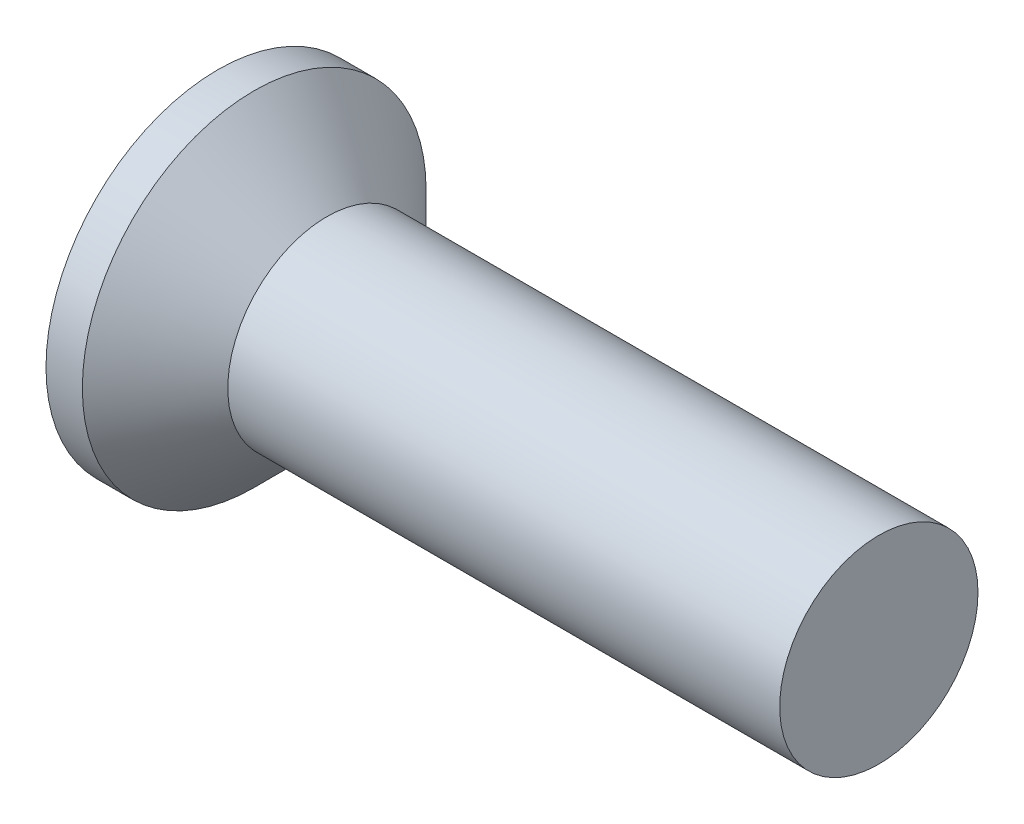
ISO-10303-21;
HEADER;
FILE_DESCRIPTION(('STEP AP214'),'2;1');
FILE_NAME('part.step','',(''),(''),'','','');
FILE_SCHEMA(('AUTOMOTIVE_DESIGN { 1 0 10303 214 1 1 1 1 }'));
ENDSEC;
DATA;
#1=APPLICATION_CONTEXT('core data for automotive mechanical design processes');
#2=APPLICATION_PROTOCOL_DEFINITION('international standard','automotive_design',2000,#1);
#3=PRODUCT_CONTEXT('',#1,'mechanical');
#4=PRODUCT('Part','Part','',(#3));
#5=PRODUCT_RELATED_PRODUCT_CATEGORY('part','',(#4));
#6=PRODUCT_DEFINITION_FORMATION('','',#4);
#7=PRODUCT_DEFINITION_CONTEXT('part definition',#1,'design');
#8=PRODUCT_DEFINITION('design','',#6,#7);
#9=PRODUCT_DEFINITION_SHAPE('','',#8);
#10=(LENGTH_UNIT() NAMED_UNIT(*) SI_UNIT(.MILLI.,.METRE.));
#11=(NAMED_UNIT(*) PLANE_ANGLE_UNIT() SI_UNIT($,.RADIAN.));
#12=(NAMED_UNIT(*) SI_UNIT($,.STERADIAN.) SOLID_ANGLE_UNIT());
#13=UNCERTAINTY_MEASURE_WITH_UNIT(LENGTH_MEASURE(1.E-05),#10,'distance_accuracy_value','');
#14=(GEOMETRIC_REPRESENTATION_CONTEXT(3) GLOBAL_UNCERTAINTY_ASSIGNED_CONTEXT((#13)) GLOBAL_UNIT_ASSIGNED_CONTEXT((#10,
#11,#12)) REPRESENTATION_CONTEXT('',''));
#15=CARTESIAN_POINT('',(0.,0.,0.));
#16=DIRECTION('',(0.,0.,1.));
#17=DIRECTION('',(1.,0.,0.));
#18=AXIS2_PLACEMENT_3D('',#15,#16,#17);
#19=CARTESIAN_POINT('',(0.,2.59999999999999,0.));
#20=DIRECTION('',(-1.,0.,0.));
#21=DIRECTION('',(0.,0.,1.));
#22=AXIS2_PLACEMENT_3D('',#19,#20,#21);
#23=PLANE('',#22);
#24=CARTESIAN_POINT('',(0.,0.,0.));
#25=DIRECTION('',(1.,0.,0.));
#26=DIRECTION('',(0.,0.,-1.));
#27=AXIS2_PLACEMENT_3D('',#24,#25,#26);
#28=CIRCLE('',#27,2.59999999999999);
#29=CARTESIAN_POINT('',(0.,0.,-2.59999999999999));
#30=VERTEX_POINT('',#29);
#31=EDGE_CURVE('E191',#30,#30,#28,.T.);
#32=ORIENTED_EDGE('',*,*,#31,.F.);
#33=EDGE_LOOP('',(#32));
#34=FACE_BOUND('',#33,.T.);
#35=DIRECTION('',(0.,1.,0.));
#36=VECTOR('',#35,1.);
#37=CARTESIAN_POINT('',(0.,-0.32,-0.32));
#38=LINE('',#37,#36);
#39=CARTESIAN_POINT('',(0.,-1.6,-0.32));
#40=VERTEX_POINT('',#39);
#41=CARTESIAN_POINT('',(0.,-0.62,-0.32));
#42=VERTEX_POINT('',#41);
#43=EDGE_CURVE('E317',#40,#42,#38,.T.);
#44=ORIENTED_EDGE('',*,*,#43,.T.);
#45=CARTESIAN_POINT('',(0.,-0.62,-0.62));
#46=DIRECTION('',(-1.,0.,0.));
#47=DIRECTION('',(0.,0.,1.));
#48=AXIS2_PLACEMENT_3D('',#45,#46,#47);
#49=CIRCLE('',#48,0.3);
#50=CARTESIAN_POINT('',(0.,-0.32,-0.62));
#51=VERTEX_POINT('',#50);
#52=EDGE_CURVE('E196',#42,#51,#49,.T.);
#53=ORIENTED_EDGE('',*,*,#52,.T.);
#54=DIRECTION('',(0.,0.,-1.));
#55=VECTOR('',#54,1.);
#56=CARTESIAN_POINT('',(0.,-0.32,-0.32));
#57=LINE('',#56,#55);
#58=CARTESIAN_POINT('',(0.,-0.32,-1.6));
#59=VERTEX_POINT('',#58);
#60=EDGE_CURVE('E319',#51,#59,#57,.T.);
#61=ORIENTED_EDGE('',*,*,#60,.T.);
#62=DIRECTION('',(0.,1.,0.));
#63=VECTOR('',#62,1.);
#64=CARTESIAN_POINT('',(0.,0.32,-1.6));
#65=LINE('',#64,#63);
#66=CARTESIAN_POINT('',(0.,0.32,-1.6));
#67=VERTEX_POINT('',#66);
#68=EDGE_CURVE('E321',#59,#67,#65,.T.);
#69=ORIENTED_EDGE('',*,*,#68,.T.);
#70=DIRECTION('',(0.,0.,1.));
#71=VECTOR('',#70,1.);
#72=CARTESIAN_POINT('',(0.,0.32,-0.32));
#73=LINE('',#72,#71);
#74=CARTESIAN_POINT('',(0.,0.32,-0.62));
#75=VERTEX_POINT('',#74);
#76=EDGE_CURVE('E324',#67,#75,#73,.T.);
#77=ORIENTED_EDGE('',*,*,#76,.T.);
#78=CARTESIAN_POINT('',(0.,0.62,-0.62));
#79=DIRECTION('',(-1.,0.,0.));
#80=DIRECTION('',(0.,0.,1.));
#81=AXIS2_PLACEMENT_3D('',#78,#79,#80);
#82=CIRCLE('',#81,0.3);
#83=CARTESIAN_POINT('',(0.,0.62,-0.32));
#84=VERTEX_POINT('',#83);
#85=EDGE_CURVE('E194',#75,#84,#82,.T.);
#86=ORIENTED_EDGE('',*,*,#85,.T.);
#87=DIRECTION('',(0.,1.,0.));
#88=VECTOR('',#87,1.);
#89=CARTESIAN_POINT('',(0.,0.32,-0.32));
#90=LINE('',#89,#88);
#91=CARTESIAN_POINT('',(0.,1.6,-0.32));
#92=VERTEX_POINT('',#91);
#93=EDGE_CURVE('E327',#84,#92,#90,.T.);
#94=ORIENTED_EDGE('',*,*,#93,.T.);
#95=DIRECTION('',(0.,0.,1.));
#96=VECTOR('',#95,1.);
#97=CARTESIAN_POINT('',(0.,1.6,-0.32));
#98=LINE('',#97,#96);
#99=CARTESIAN_POINT('',(0.,1.6,0.32));
#100=VERTEX_POINT('',#99);
#101=EDGE_CURVE('E329',#92,#100,#98,.T.);
#102=ORIENTED_EDGE('',*,*,#101,.T.);
#103=DIRECTION('',(0.,-1.,0.));
#104=VECTOR('',#103,1.);
#105=CARTESIAN_POINT('',(0.,0.32,0.32));
#106=LINE('',#105,#104);
#107=CARTESIAN_POINT('',(0.,0.62,0.32));
#108=VERTEX_POINT('',#107);
#109=EDGE_CURVE('E332',#100,#108,#106,.T.);
#110=ORIENTED_EDGE('',*,*,#109,.T.);
#111=CARTESIAN_POINT('',(0.,0.62,0.62));
#112=DIRECTION('',(-1.,0.,0.));
#113=DIRECTION('',(0.,0.,1.));
#114=AXIS2_PLACEMENT_3D('',#111,#112,#113);
#115=CIRCLE('',#114,0.3);
#116=CARTESIAN_POINT('',(0.,0.32,0.62));
#117=VERTEX_POINT('',#116);
#118=EDGE_CURVE('E159',#108,#117,#115,.T.);
#119=ORIENTED_EDGE('',*,*,#118,.T.);
#120=DIRECTION('',(0.,0.,1.));
#121=VECTOR('',#120,1.);
#122=CARTESIAN_POINT('',(0.,0.32,0.32));
#123=LINE('',#122,#121);
#124=CARTESIAN_POINT('',(0.,0.32,1.6));
#125=VERTEX_POINT('',#124);
#126=EDGE_CURVE('E153',#117,#125,#123,.T.);
#127=ORIENTED_EDGE('',*,*,#126,.T.);
#128=DIRECTION('',(0.,-1.,0.));
#129=VECTOR('',#128,1.);
#130=CARTESIAN_POINT('',(0.,0.32,1.6));
#131=LINE('',#130,#129);
#132=CARTESIAN_POINT('',(0.,-0.32,1.6));
#133=VERTEX_POINT('',#132);
#134=EDGE_CURVE('E157',#125,#133,#131,.T.);
#135=ORIENTED_EDGE('',*,*,#134,.T.);
#136=DIRECTION('',(0.,0.,-1.));
#137=VECTOR('',#136,1.);
#138=CARTESIAN_POINT('',(0.,-0.32,0.32));
#139=LINE('',#138,#137);
#140=CARTESIAN_POINT('',(0.,-0.32,0.62));
#141=VERTEX_POINT('',#140);
#142=EDGE_CURVE('E171',#133,#141,#139,.T.);
#143=ORIENTED_EDGE('',*,*,#142,.T.);
#144=CARTESIAN_POINT('',(0.,-0.62,0.62));
#145=DIRECTION('',(-1.,0.,0.));
#146=DIRECTION('',(0.,0.,1.));
#147=AXIS2_PLACEMENT_3D('',#144,#145,#146);
#148=CIRCLE('',#147,0.3);
#149=CARTESIAN_POINT('',(0.,-0.62,0.32));
#150=VERTEX_POINT('',#149);
#151=EDGE_CURVE('E190',#141,#150,#148,.T.);
#152=ORIENTED_EDGE('',*,*,#151,.T.);
#153=DIRECTION('',(0.,-1.,0.));
#154=VECTOR('',#153,1.);
#155=CARTESIAN_POINT('',(0.,-0.32,0.32));
#156=LINE('',#155,#154);
#157=CARTESIAN_POINT('',(0.,-1.6,0.319999999999999));
#158=VERTEX_POINT('',#157);
#159=EDGE_CURVE('E312',#150,#158,#156,.T.);
#160=ORIENTED_EDGE('',*,*,#159,.T.);
#161=DIRECTION('',(0.,0.,-1.));
#162=VECTOR('',#161,1.);
#163=CARTESIAN_POINT('',(0.,-1.6,-0.32));
#164=LINE('',#163,#162);
#165=EDGE_CURVE('E314',#158,#40,#164,.T.);
#166=ORIENTED_EDGE('',*,*,#165,.T.);
#167=EDGE_LOOP('',(#44,#53,#61,#69,#77,#86,#94,#102,#110,#119,#127,#135,#143,#152,#160,#166));
#168=FACE_BOUND('',#167,.T.);
#169=ADVANCED_FACE('F40',(#34,#168),#23,.T.);
#170=CARTESIAN_POINT('',(10.,1.49999999999999,0.));
#171=DIRECTION('',(1.,0.,0.));
#172=DIRECTION('',(0.,0.,-1.));
#173=AXIS2_PLACEMENT_3D('',#170,#171,#172);
#174=PLANE('',#173);
#175=CARTESIAN_POINT('',(9.99999999999999,0.,0.));
#176=DIRECTION('',(1.,0.,0.));
#177=DIRECTION('',(0.,0.,-1.));
#178=AXIS2_PLACEMENT_3D('',#175,#176,#177);
#179=CIRCLE('',#178,1.49999999999999);
#180=CARTESIAN_POINT('',(9.99999999999999,0.,-1.49999999999999));
#181=VERTEX_POINT('',#180);
#182=EDGE_CURVE('E177',#181,#181,#179,.T.);
#183=ORIENTED_EDGE('',*,*,#182,.T.);
#184=EDGE_LOOP('',(#183));
#185=FACE_BOUND('',#184,.T.);
#186=ADVANCED_FACE('F244',(#185),#174,.T.);
#187=CARTESIAN_POINT('',(4.51581291088132,0.,0.));
#188=DIRECTION('',(1.,0.,0.));
#189=DIRECTION('',(0.,0.,-1.));
#190=AXIS2_PLACEMENT_3D('',#187,#188,#189);
#191=CYLINDRICAL_SURFACE('',#190,2.59999999999999);
#192=ORIENTED_EDGE('',*,*,#31,.T.);
#193=EDGE_LOOP('',(#192));
#194=FACE_BOUND('',#193,.T.);
#195=CARTESIAN_POINT('',(0.550000000000004,0.,0.));
#196=DIRECTION('',(1.,0.,0.));
#197=DIRECTION('',(0.,0.,-1.));
#198=AXIS2_PLACEMENT_3D('',#195,#196,#197);
#199=CIRCLE('',#198,2.59999999999999);
#200=CARTESIAN_POINT('',(0.550000000000004,0.,-2.59999999999999));
#201=VERTEX_POINT('',#200);
#202=EDGE_CURVE('E336',#201,#201,#199,.T.);
#203=ORIENTED_EDGE('',*,*,#202,.F.);
#204=EDGE_LOOP('',(#203));
#205=FACE_BOUND('',#204,.T.);
#206=ADVANCED_FACE('F250',(#194,#205),#191,.T.);
#207=CARTESIAN_POINT('',(1.65,0.,0.));
#208=DIRECTION('',(-1.,0.,0.));
#209=DIRECTION('',(0.,0.,1.));
#210=AXIS2_PLACEMENT_3D('',#207,#208,#209);
#211=CONICAL_SURFACE('',#210,1.49999999999999,0.78539816339745);
#212=ORIENTED_EDGE('',*,*,#202,.T.);
#213=EDGE_LOOP('',(#212));
#214=FACE_BOUND('',#213,.T.);
#215=CARTESIAN_POINT('',(1.65,0.,0.));
#216=DIRECTION('',(1.,0.,0.));
#217=DIRECTION('',(0.,0.,-1.));
#218=AXIS2_PLACEMENT_3D('',#215,#216,#217);
#219=CIRCLE('',#218,1.49999999999999);
#220=CARTESIAN_POINT('',(1.65,0.,-1.49999999999999));
#221=VERTEX_POINT('',#220);
#222=EDGE_CURVE('E180',#221,#221,#219,.T.);
#223=ORIENTED_EDGE('',*,*,#222,.F.);
#224=EDGE_LOOP('',(#223));
#225=FACE_BOUND('',#224,.T.);
#226=ADVANCED_FACE('F372',(#214,#225),#211,.T.);
#227=CARTESIAN_POINT('',(4.51581291088132,0.,0.));
#228=DIRECTION('',(1.,0.,0.));
#229=DIRECTION('',(0.,0.,-1.));
#230=AXIS2_PLACEMENT_3D('',#227,#228,#229);
#231=CYLINDRICAL_SURFACE('',#230,1.49999999999999);
#232=ORIENTED_EDGE('',*,*,#222,.T.);
#233=EDGE_LOOP('',(#232));
#234=FACE_BOUND('',#233,.T.);
#235=ORIENTED_EDGE('',*,*,#182,.F.);
#236=EDGE_LOOP('',(#235));
#237=FACE_BOUND('',#236,.T.);
#238=ADVANCED_FACE('F370',(#234,#237),#231,.T.);
#239=CARTESIAN_POINT('',(0.825,0.32,0.32));
#240=DIRECTION('',(0.,-1.,0.));
#241=DIRECTION('',(0.,0.,-1.));
#242=AXIS2_PLACEMENT_3D('',#239,#240,#241);
#243=PLANE('',#242);
#244=ORIENTED_EDGE('',*,*,#126,.F.);
#245=DIRECTION('',(-1.,0.,0.));
#246=VECTOR('',#245,1.);
#247=CARTESIAN_POINT('',(0.825,0.32,0.62));
#248=LINE('',#247,#246);
#249=CARTESIAN_POINT('',(0.825,0.32,0.62));
#250=VERTEX_POINT('',#249);
#251=EDGE_CURVE('E208',#117,#250,#248,.F.);
#252=ORIENTED_EDGE('',*,*,#251,.T.);
#253=DIRECTION('',(0.,0.,1.));
#254=VECTOR('',#253,1.);
#255=CARTESIAN_POINT('',(0.825,0.32,0.32));
#256=LINE('',#255,#254);
#257=CARTESIAN_POINT('',(0.825,0.32,1.12368602791856));
#258=VERTEX_POINT('',#257);
#259=EDGE_CURVE('E175',#250,#258,#256,.T.);
#260=ORIENTED_EDGE('',*,*,#259,.T.);
#261=DIRECTION('',(-0.866025403784438,0.,0.500000000000001));
#262=VECTOR('',#261,1.);
#263=CARTESIAN_POINT('',(0.,0.32,1.6));
#264=LINE('',#263,#262);
#265=EDGE_CURVE('E167',#258,#125,#264,.T.);
#266=ORIENTED_EDGE('',*,*,#265,.T.);
#267=EDGE_LOOP('',(#244,#252,#260,#266));
#268=FACE_BOUND('',#267,.T.);
#269=ADVANCED_FACE('F173',(#268),#243,.T.);
#270=CARTESIAN_POINT('',(0.,0.32,1.6));
#271=DIRECTION('',(-0.500000000000001,0.,-0.866025403784438));
#272=DIRECTION('',(-0.866025403784438,0.,0.500000000000001));
#273=AXIS2_PLACEMENT_3D('',#270,#271,#272);
#274=PLANE('',#273);
#275=ORIENTED_EDGE('',*,*,#134,.F.);
#276=ORIENTED_EDGE('',*,*,#265,.F.);
#277=DIRECTION('',(0.,-1.,0.));
#278=VECTOR('',#277,1.);
#279=CARTESIAN_POINT('',(0.825,0.32,1.12368602791856));
#280=LINE('',#279,#278);
#281=CARTESIAN_POINT('',(0.825,-0.32,1.12368602791856));
#282=VERTEX_POINT('',#281);
#283=EDGE_CURVE('E186',#258,#282,#280,.T.);
#284=ORIENTED_EDGE('',*,*,#283,.T.);
#285=DIRECTION('',(-0.866025403784438,0.,0.500000000000001));
#286=VECTOR('',#285,1.);
#287=CARTESIAN_POINT('',(1.17300625842204,-0.32,0.922764520938917));
#288=LINE('',#287,#286);
#289=EDGE_CURVE('E169',#282,#133,#288,.T.);
#290=ORIENTED_EDGE('',*,*,#289,.T.);
#291=EDGE_LOOP('',(#275,#276,#284,#290));
#292=FACE_BOUND('',#291,.T.);
#293=ADVANCED_FACE('F166',(#292),#274,.T.);
#294=CARTESIAN_POINT('',(0.825,-0.32,0.32));
#295=DIRECTION('',(0.,1.,0.));
#296=DIRECTION('',(0.,0.,1.));
#297=AXIS2_PLACEMENT_3D('',#294,#295,#296);
#298=PLANE('',#297);
#299=DIRECTION('',(0.,0.,-1.));
#300=VECTOR('',#299,1.);
#301=CARTESIAN_POINT('',(0.825,-0.32,0.32));
#302=LINE('',#301,#300);
#303=CARTESIAN_POINT('',(0.825,-0.32,0.62));
#304=VERTEX_POINT('',#303);
#305=EDGE_CURVE('E358',#282,#304,#302,.T.);
#306=ORIENTED_EDGE('',*,*,#305,.T.);
#307=DIRECTION('',(-1.,0.,0.));
#308=VECTOR('',#307,1.);
#309=CARTESIAN_POINT('',(0.825,-0.32,0.62));
#310=LINE('',#309,#308);
#311=EDGE_CURVE('E210',#304,#141,#310,.T.);
#312=ORIENTED_EDGE('',*,*,#311,.T.);
#313=ORIENTED_EDGE('',*,*,#142,.F.);
#314=ORIENTED_EDGE('',*,*,#289,.F.);
#315=EDGE_LOOP('',(#306,#312,#313,#314));
#316=FACE_BOUND('',#315,.T.);
#317=ADVANCED_FACE('F264',(#316),#298,.T.);
#318=CARTESIAN_POINT('',(0.825,-0.32,0.32));
#319=DIRECTION('',(0.,0.,-1.));
#320=DIRECTION('',(0.,1.,0.));
#321=AXIS2_PLACEMENT_3D('',#318,#319,#320);
#322=PLANE('',#321);
#323=ORIENTED_EDGE('',*,*,#159,.F.);
#324=DIRECTION('',(-1.,0.,0.));
#325=VECTOR('',#324,1.);
#326=CARTESIAN_POINT('',(0.825,-0.62,0.32));
#327=LINE('',#326,#325);
#328=CARTESIAN_POINT('',(0.825,-0.62,0.32));
#329=VERTEX_POINT('',#328);
#330=EDGE_CURVE('E55',#150,#329,#327,.F.);
#331=ORIENTED_EDGE('',*,*,#330,.T.);
#332=DIRECTION('',(0.,-1.,0.));
#333=VECTOR('',#332,1.);
#334=CARTESIAN_POINT('',(0.825,-0.32,0.32));
#335=LINE('',#334,#333);
#336=CARTESIAN_POINT('',(0.825,-1.12368602791856,0.319999999999999));
#337=VERTEX_POINT('',#336);
#338=EDGE_CURVE('E301',#329,#337,#335,.T.);
#339=ORIENTED_EDGE('',*,*,#338,.T.);
#340=DIRECTION('',(-0.866025403784438,-0.500000000000001,0.));
#341=VECTOR('',#340,1.);
#342=CARTESIAN_POINT('',(0.,-1.6,0.319999999999999));
#343=LINE('',#342,#341);
#344=EDGE_CURVE('E182',#337,#158,#343,.T.);
#345=ORIENTED_EDGE('',*,*,#344,.T.);
#346=EDGE_LOOP('',(#323,#331,#339,#345));
#347=FACE_BOUND('',#346,.T.);
#348=ADVANCED_FACE('F269',(#347),#322,.T.);
#349=CARTESIAN_POINT('',(0.,-1.6,-0.32));
#350=DIRECTION('',(-0.500000000000001,0.866025403784438,0.));
#351=DIRECTION('',(-0.866025403784438,-0.500000000000001,0.));
#352=AXIS2_PLACEMENT_3D('',#349,#350,#351);
#353=PLANE('',#352);
#354=ORIENTED_EDGE('',*,*,#165,.F.);
#355=ORIENTED_EDGE('',*,*,#344,.F.);
#356=DIRECTION('',(0.,0.,-1.));
#357=VECTOR('',#356,1.);
#358=CARTESIAN_POINT('',(0.825,-1.12368602791856,-0.32));
#359=LINE('',#358,#357);
#360=CARTESIAN_POINT('',(0.825,-1.12368602791856,-0.32));
#361=VERTEX_POINT('',#360);
#362=EDGE_CURVE('E297',#337,#361,#359,.T.);
#363=ORIENTED_EDGE('',*,*,#362,.T.);
#364=DIRECTION('',(-0.866025403784438,-0.500000000000001,0.));
#365=VECTOR('',#364,1.);
#366=CARTESIAN_POINT('',(1.17300625842204,-0.922764520938917,-0.32));
#367=LINE('',#366,#365);
#368=EDGE_CURVE('E296',#361,#40,#367,.T.);
#369=ORIENTED_EDGE('',*,*,#368,.T.);
#370=EDGE_LOOP('',(#354,#355,#363,#369));
#371=FACE_BOUND('',#370,.T.);
#372=ADVANCED_FACE('F265',(#371),#353,.T.);
#373=CARTESIAN_POINT('',(0.825,-0.32,-0.32));
#374=DIRECTION('',(0.,0.,1.));
#375=DIRECTION('',(0.,-1.,0.));
#376=AXIS2_PLACEMENT_3D('',#373,#374,#375);
#377=PLANE('',#376);
#378=DIRECTION('',(0.,1.,0.));
#379=VECTOR('',#378,1.);
#380=CARTESIAN_POINT('',(0.825,-0.32,-0.32));
#381=LINE('',#380,#379);
#382=CARTESIAN_POINT('',(0.825,-0.62,-0.32));
#383=VERTEX_POINT('',#382);
#384=EDGE_CURVE('E290',#361,#383,#381,.T.);
#385=ORIENTED_EDGE('',*,*,#384,.T.);
#386=DIRECTION('',(-1.,0.,0.));
#387=VECTOR('',#386,1.);
#388=CARTESIAN_POINT('',(0.825,-0.62,-0.32));
#389=LINE('',#388,#387);
#390=EDGE_CURVE('E187',#383,#42,#389,.T.);
#391=ORIENTED_EDGE('',*,*,#390,.T.);
#392=ORIENTED_EDGE('',*,*,#43,.F.);
#393=ORIENTED_EDGE('',*,*,#368,.F.);
#394=EDGE_LOOP('',(#385,#391,#392,#393));
#395=FACE_BOUND('',#394,.T.);
#396=ADVANCED_FACE('F268',(#395),#377,.T.);
#397=CARTESIAN_POINT('',(0.825,-0.32,-0.32));
#398=DIRECTION('',(0.,1.,0.));
#399=DIRECTION('',(0.,0.,1.));
#400=AXIS2_PLACEMENT_3D('',#397,#398,#399);
#401=PLANE('',#400);
#402=ORIENTED_EDGE('',*,*,#60,.F.);
#403=DIRECTION('',(-1.,0.,0.));
#404=VECTOR('',#403,1.);
#405=CARTESIAN_POINT('',(0.825,-0.32,-0.62));
#406=LINE('',#405,#404);
#407=CARTESIAN_POINT('',(0.825,-0.32,-0.62));
#408=VERTEX_POINT('',#407);
#409=EDGE_CURVE('E198',#51,#408,#406,.F.);
#410=ORIENTED_EDGE('',*,*,#409,.T.);
#411=DIRECTION('',(0.,0.,-1.));
#412=VECTOR('',#411,1.);
#413=CARTESIAN_POINT('',(0.825,-0.32,-0.32));
#414=LINE('',#413,#412);
#415=CARTESIAN_POINT('',(0.825,-0.32,-1.12368602791856));
#416=VERTEX_POINT('',#415);
#417=EDGE_CURVE('E292',#408,#416,#414,.T.);
#418=ORIENTED_EDGE('',*,*,#417,.T.);
#419=DIRECTION('',(-0.866025403784438,0.,-0.500000000000001));
#420=VECTOR('',#419,1.);
#421=CARTESIAN_POINT('',(0.,-0.32,-1.6));
#422=LINE('',#421,#420);
#423=EDGE_CURVE('E348',#416,#59,#422,.T.);
#424=ORIENTED_EDGE('',*,*,#423,.T.);
#425=EDGE_LOOP('',(#402,#410,#418,#424));
#426=FACE_BOUND('',#425,.T.);
#427=ADVANCED_FACE('F275',(#426),#401,.T.);
#428=CARTESIAN_POINT('',(0.,0.32,-1.6));
#429=DIRECTION('',(-0.500000000000001,0.,0.866025403784438));
#430=DIRECTION('',(0.866025403784438,0.,0.500000000000001));
#431=AXIS2_PLACEMENT_3D('',#428,#429,#430);
#432=PLANE('',#431);
#433=ORIENTED_EDGE('',*,*,#68,.F.);
#434=ORIENTED_EDGE('',*,*,#423,.F.);
#435=DIRECTION('',(0.,1.,0.));
#436=VECTOR('',#435,1.);
#437=CARTESIAN_POINT('',(0.825,0.32,-1.12368602791856));
#438=LINE('',#437,#436);
#439=CARTESIAN_POINT('',(0.825,0.32,-1.12368602791856));
#440=VERTEX_POINT('',#439);
#441=EDGE_CURVE('E299',#416,#440,#438,.T.);
#442=ORIENTED_EDGE('',*,*,#441,.T.);
#443=DIRECTION('',(-0.866025403784438,0.,-0.500000000000001));
#444=VECTOR('',#443,1.);
#445=CARTESIAN_POINT('',(1.17300625842204,0.32,-0.922764520938917));
#446=LINE('',#445,#444);
#447=EDGE_CURVE('E346',#440,#67,#446,.T.);
#448=ORIENTED_EDGE('',*,*,#447,.T.);
#449=EDGE_LOOP('',(#433,#434,#442,#448));
#450=FACE_BOUND('',#449,.T.);
#451=ADVANCED_FACE('F271',(#450),#432,.T.);
#452=CARTESIAN_POINT('',(0.825,0.32,-0.32));
#453=DIRECTION('',(0.,-1.,0.));
#454=DIRECTION('',(0.,0.,-1.));
#455=AXIS2_PLACEMENT_3D('',#452,#453,#454);
#456=PLANE('',#455);
#457=DIRECTION('',(0.,0.,1.));
#458=VECTOR('',#457,1.);
#459=CARTESIAN_POINT('',(0.825,0.32,-0.32));
#460=LINE('',#459,#458);
#461=CARTESIAN_POINT('',(0.825,0.32,-0.62));
#462=VERTEX_POINT('',#461);
#463=EDGE_CURVE('E306',#440,#462,#460,.T.);
#464=ORIENTED_EDGE('',*,*,#463,.T.);
#465=DIRECTION('',(-1.,0.,0.));
#466=VECTOR('',#465,1.);
#467=CARTESIAN_POINT('',(0.825,0.32,-0.62));
#468=LINE('',#467,#466);
#469=EDGE_CURVE('E200',#462,#75,#468,.T.);
#470=ORIENTED_EDGE('',*,*,#469,.T.);
#471=ORIENTED_EDGE('',*,*,#76,.F.);
#472=ORIENTED_EDGE('',*,*,#447,.F.);
#473=EDGE_LOOP('',(#464,#470,#471,#472));
#474=FACE_BOUND('',#473,.T.);
#475=ADVANCED_FACE('F274',(#474),#456,.T.);
#476=CARTESIAN_POINT('',(0.825,0.32,-0.32));
#477=DIRECTION('',(0.,0.,1.));
#478=DIRECTION('',(0.,-1.,0.));
#479=AXIS2_PLACEMENT_3D('',#476,#477,#478);
#480=PLANE('',#479);
#481=ORIENTED_EDGE('',*,*,#93,.F.);
#482=DIRECTION('',(-1.,0.,0.));
#483=VECTOR('',#482,1.);
#484=CARTESIAN_POINT('',(0.825,0.62,-0.32));
#485=LINE('',#484,#483);
#486=CARTESIAN_POINT('',(0.825,0.62,-0.32));
#487=VERTEX_POINT('',#486);
#488=EDGE_CURVE('E203',#84,#487,#485,.F.);
#489=ORIENTED_EDGE('',*,*,#488,.T.);
#490=DIRECTION('',(0.,1.,0.));
#491=VECTOR('',#490,1.);
#492=CARTESIAN_POINT('',(0.825,0.32,-0.32));
#493=LINE('',#492,#491);
#494=CARTESIAN_POINT('',(0.825,1.12368602791856,-0.32));
#495=VERTEX_POINT('',#494);
#496=EDGE_CURVE('E309',#487,#495,#493,.T.);
#497=ORIENTED_EDGE('',*,*,#496,.T.);
#498=DIRECTION('',(-0.866025403784438,0.500000000000001,0.));
#499=VECTOR('',#498,1.);
#500=CARTESIAN_POINT('',(0.,1.6,-0.32));
#501=LINE('',#500,#499);
#502=EDGE_CURVE('E342',#495,#92,#501,.T.);
#503=ORIENTED_EDGE('',*,*,#502,.T.);
#504=EDGE_LOOP('',(#481,#489,#497,#503));
#505=FACE_BOUND('',#504,.T.);
#506=ADVANCED_FACE('F260',(#505),#480,.T.);
#507=CARTESIAN_POINT('',(0.,1.6,-0.32));
#508=DIRECTION('',(-0.500000000000001,-0.866025403784438,0.));
#509=DIRECTION('',(0.866025403784438,-0.500000000000001,0.));
#510=AXIS2_PLACEMENT_3D('',#507,#508,#509);
#511=PLANE('',#510);
#512=ORIENTED_EDGE('',*,*,#101,.F.);
#513=ORIENTED_EDGE('',*,*,#502,.F.);
#514=DIRECTION('',(0.,0.,1.));
#515=VECTOR('',#514,1.);
#516=CARTESIAN_POINT('',(0.825,1.12368602791856,-0.32));
#517=LINE('',#516,#515);
#518=CARTESIAN_POINT('',(0.825,1.12368602791856,0.32));
#519=VERTEX_POINT('',#518);
#520=EDGE_CURVE('E230',#495,#519,#517,.T.);
#521=ORIENTED_EDGE('',*,*,#520,.T.);
#522=DIRECTION('',(-0.866025403784438,0.500000000000001,0.));
#523=VECTOR('',#522,1.);
#524=CARTESIAN_POINT('',(1.17300625842204,0.922764520938917,0.32));
#525=LINE('',#524,#523);
#526=EDGE_CURVE('E229',#519,#100,#525,.T.);
#527=ORIENTED_EDGE('',*,*,#526,.T.);
#528=EDGE_LOOP('',(#512,#513,#521,#527));
#529=FACE_BOUND('',#528,.T.);
#530=ADVANCED_FACE('F257',(#529),#511,.T.);
#531=CARTESIAN_POINT('',(0.825,0.32,0.32));
#532=DIRECTION('',(0.,0.,-1.));
#533=DIRECTION('',(0.,1.,0.));
#534=AXIS2_PLACEMENT_3D('',#531,#532,#533);
#535=PLANE('',#534);
#536=DIRECTION('',(0.,-1.,0.));
#537=VECTOR('',#536,1.);
#538=CARTESIAN_POINT('',(0.825,0.32,0.32));
#539=LINE('',#538,#537);
#540=CARTESIAN_POINT('',(0.825,0.62,0.32));
#541=VERTEX_POINT('',#540);
#542=EDGE_CURVE('E222',#519,#541,#539,.T.);
#543=ORIENTED_EDGE('',*,*,#542,.T.);
#544=DIRECTION('',(-1.,0.,0.));
#545=VECTOR('',#544,1.);
#546=CARTESIAN_POINT('',(0.825,0.62,0.32));
#547=LINE('',#546,#545);
#548=EDGE_CURVE('E205',#541,#108,#547,.T.);
#549=ORIENTED_EDGE('',*,*,#548,.T.);
#550=ORIENTED_EDGE('',*,*,#109,.F.);
#551=ORIENTED_EDGE('',*,*,#526,.F.);
#552=EDGE_LOOP('',(#543,#549,#550,#551));
#553=FACE_BOUND('',#552,.T.);
#554=ADVANCED_FACE('F227',(#553),#535,.T.);
#555=CARTESIAN_POINT('',(0.825,0.32,0.32));
#556=DIRECTION('',(1.,0.,0.));
#557=DIRECTION('',(0.,0.,-1.));
#558=AXIS2_PLACEMENT_3D('',#555,#556,#557);
#559=PLANE('',#558);
#560=ORIENTED_EDGE('',*,*,#259,.F.);
#561=CARTESIAN_POINT('',(0.825,0.62,0.62));
#562=DIRECTION('',(1.,0.,0.));
#563=DIRECTION('',(0.,0.,-1.));
#564=AXIS2_PLACEMENT_3D('',#561,#562,#563);
#565=CIRCLE('',#564,0.3);
#566=EDGE_CURVE('E48',#250,#541,#565,.T.);
#567=ORIENTED_EDGE('',*,*,#566,.T.);
#568=ORIENTED_EDGE('',*,*,#542,.F.);
#569=ORIENTED_EDGE('',*,*,#520,.F.);
#570=ORIENTED_EDGE('',*,*,#496,.F.);
#571=CARTESIAN_POINT('',(0.825,0.62,-0.62));
#572=DIRECTION('',(1.,0.,0.));
#573=DIRECTION('',(0.,0.,-1.));
#574=AXIS2_PLACEMENT_3D('',#571,#572,#573);
#575=CIRCLE('',#574,0.3);
#576=EDGE_CURVE('E216',#487,#462,#575,.T.);
#577=ORIENTED_EDGE('',*,*,#576,.T.);
#578=ORIENTED_EDGE('',*,*,#463,.F.);
#579=ORIENTED_EDGE('',*,*,#441,.F.);
#580=ORIENTED_EDGE('',*,*,#417,.F.);
#581=CARTESIAN_POINT('',(0.825,-0.62,-0.62));
#582=DIRECTION('',(1.,0.,0.));
#583=DIRECTION('',(0.,0.,-1.));
#584=AXIS2_PLACEMENT_3D('',#581,#582,#583);
#585=CIRCLE('',#584,0.3);
#586=EDGE_CURVE('E214',#408,#383,#585,.T.);
#587=ORIENTED_EDGE('',*,*,#586,.T.);
#588=ORIENTED_EDGE('',*,*,#384,.F.);
#589=ORIENTED_EDGE('',*,*,#362,.F.);
#590=ORIENTED_EDGE('',*,*,#338,.F.);
#591=CARTESIAN_POINT('',(0.825,-0.62,0.62));
#592=DIRECTION('',(1.,0.,0.));
#593=DIRECTION('',(0.,0.,-1.));
#594=AXIS2_PLACEMENT_3D('',#591,#592,#593);
#595=CIRCLE('',#594,0.3);
#596=EDGE_CURVE('E11',#329,#304,#595,.T.);
#597=ORIENTED_EDGE('',*,*,#596,.T.);
#598=ORIENTED_EDGE('',*,*,#305,.F.);
#599=ORIENTED_EDGE('',*,*,#283,.F.);
#600=EDGE_LOOP('',(#560,#567,#568,#569,#570,#577,#578,#579,#580,#587,#588,#589,#590,#597,#598,#599));
#601=FACE_BOUND('',#600,.T.);
#602=ADVANCED_FACE('F220',(#601),#559,.F.);
#603=CARTESIAN_POINT('',(0.825,-0.62,-0.62));
#604=DIRECTION('',(-1.,0.,0.));
#605=DIRECTION('',(0.,0.,1.));
#606=AXIS2_PLACEMENT_3D('',#603,#604,#605);
#607=CYLINDRICAL_SURFACE('',#606,0.3);
#608=ORIENTED_EDGE('',*,*,#586,.F.);
#609=ORIENTED_EDGE('',*,*,#409,.F.);
#610=ORIENTED_EDGE('',*,*,#52,.F.);
#611=ORIENTED_EDGE('',*,*,#390,.F.);
#612=EDGE_LOOP('',(#608,#609,#610,#611));
#613=FACE_BOUND('',#612,.T.);
#614=ADVANCED_FACE('F240',(#613),#607,.T.);
#615=CARTESIAN_POINT('',(0.825,0.62,-0.62));
#616=DIRECTION('',(-1.,0.,0.));
#617=DIRECTION('',(0.,0.,1.));
#618=AXIS2_PLACEMENT_3D('',#615,#616,#617);
#619=CYLINDRICAL_SURFACE('',#618,0.3);
#620=ORIENTED_EDGE('',*,*,#576,.F.);
#621=ORIENTED_EDGE('',*,*,#488,.F.);
#622=ORIENTED_EDGE('',*,*,#85,.F.);
#623=ORIENTED_EDGE('',*,*,#469,.F.);
#624=EDGE_LOOP('',(#620,#621,#622,#623));
#625=FACE_BOUND('',#624,.T.);
#626=ADVANCED_FACE('F234',(#625),#619,.T.);
#627=CARTESIAN_POINT('',(0.825,0.62,0.62));
#628=DIRECTION('',(-1.,0.,0.));
#629=DIRECTION('',(0.,0.,1.));
#630=AXIS2_PLACEMENT_3D('',#627,#628,#629);
#631=CYLINDRICAL_SURFACE('',#630,0.3);
#632=ORIENTED_EDGE('',*,*,#566,.F.);
#633=ORIENTED_EDGE('',*,*,#251,.F.);
#634=ORIENTED_EDGE('',*,*,#118,.F.);
#635=ORIENTED_EDGE('',*,*,#548,.F.);
#636=EDGE_LOOP('',(#632,#633,#634,#635));
#637=FACE_BOUND('',#636,.T.);
#638=ADVANCED_FACE('F232',(#637),#631,.T.);
#639=CARTESIAN_POINT('',(0.825,-0.62,0.62));
#640=DIRECTION('',(-1.,0.,0.));
#641=DIRECTION('',(0.,0.,1.));
#642=AXIS2_PLACEMENT_3D('',#639,#640,#641);
#643=CYLINDRICAL_SURFACE('',#642,0.3);
#644=ORIENTED_EDGE('',*,*,#596,.F.);
#645=ORIENTED_EDGE('',*,*,#330,.F.);
#646=ORIENTED_EDGE('',*,*,#151,.F.);
#647=ORIENTED_EDGE('',*,*,#311,.F.);
#648=EDGE_LOOP('',(#644,#645,#646,#647));
#649=FACE_BOUND('',#648,.T.);
#650=ADVANCED_FACE('F42',(#649),#643,.T.);
#651=CLOSED_SHELL('',(#169,#186,#206,#226,#238,#269,#293,#317,#348,#372,#396,#427,#451,#475,
#506,#530,#554,#602,#614,#626,#638,#650));
#652=MANIFOLD_SOLID_BREP('B2',#651);
#653=ADVANCED_BREP_SHAPE_REPRESENTATION('',(#18,#652),#14);
#654=SHAPE_DEFINITION_REPRESENTATION(#9,#653);
ENDSEC;
END-ISO-10303-21;
